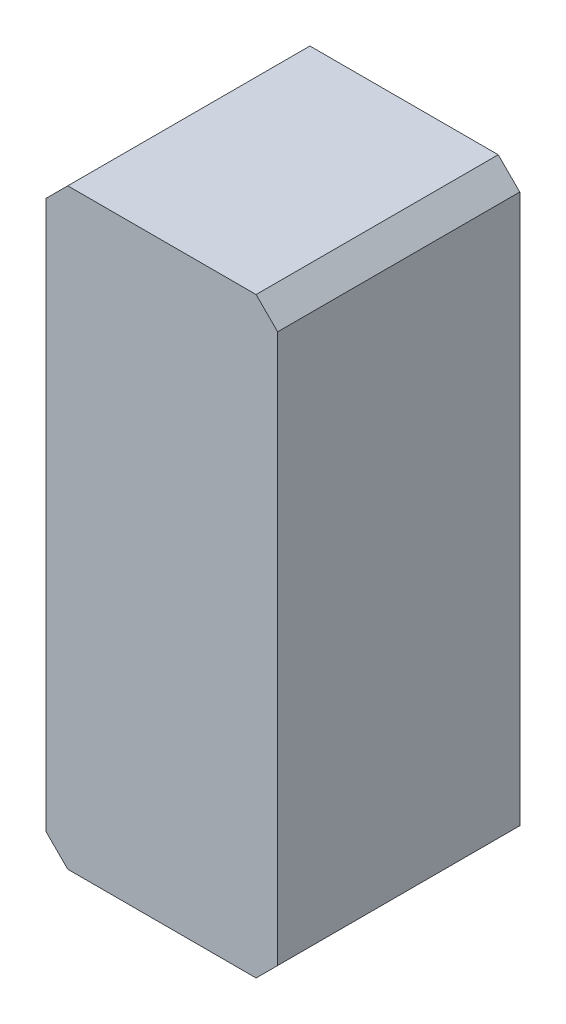
ISO-10303-21;
HEADER;
FILE_DESCRIPTION(('STEP AP214'),'2;1');
FILE_NAME('part.step','',(''),(''),'','','');
FILE_SCHEMA(('AUTOMOTIVE_DESIGN { 1 0 10303 214 1 1 1 1 }'));
ENDSEC;
DATA;
#1=APPLICATION_CONTEXT('core data for automotive mechanical design processes');
#2=APPLICATION_PROTOCOL_DEFINITION('international standard','automotive_design',2000,#1);
#3=PRODUCT_CONTEXT('',#1,'mechanical');
#4=PRODUCT('Part','Part','',(#3));
#5=PRODUCT_RELATED_PRODUCT_CATEGORY('part','',(#4));
#6=PRODUCT_DEFINITION_FORMATION('','',#4);
#7=PRODUCT_DEFINITION_CONTEXT('part definition',#1,'design');
#8=PRODUCT_DEFINITION('design','',#6,#7);
#9=PRODUCT_DEFINITION_SHAPE('','',#8);
#10=(LENGTH_UNIT() NAMED_UNIT(*) SI_UNIT(.MILLI.,.METRE.));
#11=(NAMED_UNIT(*) PLANE_ANGLE_UNIT() SI_UNIT($,.RADIAN.));
#12=(NAMED_UNIT(*) SI_UNIT($,.STERADIAN.) SOLID_ANGLE_UNIT());
#13=UNCERTAINTY_MEASURE_WITH_UNIT(LENGTH_MEASURE(1.E-05),#10,'distance_accuracy_value','');
#14=(GEOMETRIC_REPRESENTATION_CONTEXT(3) GLOBAL_UNCERTAINTY_ASSIGNED_CONTEXT((#13)) GLOBAL_UNIT_ASSIGNED_CONTEXT((#10,
#11,#12)) REPRESENTATION_CONTEXT('',''));
#15=CARTESIAN_POINT('',(0.,0.,0.));
#16=DIRECTION('',(0.,0.,1.));
#17=DIRECTION('',(1.,0.,0.));
#18=AXIS2_PLACEMENT_3D('',#15,#16,#17);
#19=CARTESIAN_POINT('',(-21.5,-51.,45.));
#20=DIRECTION('',(0.707106781186548,0.707106781186547,0.));
#21=DIRECTION('',(-0.707106781186547,0.707106781186548,0.));
#22=AXIS2_PLACEMENT_3D('',#19,#20,#21);
#23=PLANE('',#22);
#24=DIRECTION('',(0.707106781186547,-0.707106781186548,0.));
#25=VECTOR('',#24,1.);
#26=CARTESIAN_POINT('',(-21.5,-51.,0.));
#27=LINE('',#26,#25);
#28=CARTESIAN_POINT('',(-21.5,-51.,0.));
#29=VERTEX_POINT('',#28);
#30=CARTESIAN_POINT('',(-17.5,-55.,0.));
#31=VERTEX_POINT('',#30);
#32=EDGE_CURVE('E137',#29,#31,#27,.T.);
#33=ORIENTED_EDGE('',*,*,#32,.T.);
#34=DIRECTION('',(0.,0.,-1.));
#35=VECTOR('',#34,1.);
#36=CARTESIAN_POINT('',(-17.5,-55.,45.));
#37=LINE('',#36,#35);
#38=CARTESIAN_POINT('',(-17.5,-55.,45.));
#39=VERTEX_POINT('',#38);
#40=EDGE_CURVE('E11',#39,#31,#37,.T.);
#41=ORIENTED_EDGE('',*,*,#40,.F.);
#42=DIRECTION('',(0.707106781186547,-0.707106781186548,0.));
#43=VECTOR('',#42,1.);
#44=CARTESIAN_POINT('',(-21.5,-51.,45.));
#45=LINE('',#44,#43);
#46=CARTESIAN_POINT('',(-21.5,-51.,45.));
#47=VERTEX_POINT('',#46);
#48=EDGE_CURVE('E151',#47,#39,#45,.T.);
#49=ORIENTED_EDGE('',*,*,#48,.F.);
#50=DIRECTION('',(0.,0.,-1.));
#51=VECTOR('',#50,1.);
#52=CARTESIAN_POINT('',(-21.5,-51.,45.));
#53=LINE('',#52,#51);
#54=EDGE_CURVE('E133',#47,#29,#53,.T.);
#55=ORIENTED_EDGE('',*,*,#54,.T.);
#56=EDGE_LOOP('',(#33,#41,#49,#55));
#57=FACE_BOUND('',#56,.T.);
#58=ADVANCED_FACE('F41',(#57),#23,.F.);
#59=CARTESIAN_POINT('',(-17.5,-55.,45.));
#60=DIRECTION('',(0.,1.,0.));
#61=DIRECTION('',(0.,0.,1.));
#62=AXIS2_PLACEMENT_3D('',#59,#60,#61);
#63=PLANE('',#62);
#64=DIRECTION('',(1.,0.,0.));
#65=VECTOR('',#64,1.);
#66=CARTESIAN_POINT('',(-17.5,-55.,0.));
#67=LINE('',#66,#65);
#68=CARTESIAN_POINT('',(17.5,-55.,0.));
#69=VERTEX_POINT('',#68);
#70=EDGE_CURVE('E140',#31,#69,#67,.T.);
#71=ORIENTED_EDGE('',*,*,#70,.T.);
#72=DIRECTION('',(0.,0.,-1.));
#73=VECTOR('',#72,1.);
#74=CARTESIAN_POINT('',(17.5,-55.,45.));
#75=LINE('',#74,#73);
#76=CARTESIAN_POINT('',(17.5,-55.,45.));
#77=VERTEX_POINT('',#76);
#78=EDGE_CURVE('E49',#77,#69,#75,.T.);
#79=ORIENTED_EDGE('',*,*,#78,.F.);
#80=DIRECTION('',(1.,0.,0.));
#81=VECTOR('',#80,1.);
#82=CARTESIAN_POINT('',(-17.5,-55.,45.));
#83=LINE('',#82,#81);
#84=EDGE_CURVE('E100',#39,#77,#83,.T.);
#85=ORIENTED_EDGE('',*,*,#84,.F.);
#86=ORIENTED_EDGE('',*,*,#40,.T.);
#87=EDGE_LOOP('',(#71,#79,#85,#86));
#88=FACE_BOUND('',#87,.T.);
#89=ADVANCED_FACE('F186',(#88),#63,.F.);
#90=CARTESIAN_POINT('',(17.5,-55.,45.));
#91=DIRECTION('',(-0.707106781186548,0.707106781186547,0.));
#92=DIRECTION('',(-0.707106781186547,-0.707106781186548,0.));
#93=AXIS2_PLACEMENT_3D('',#90,#91,#92);
#94=PLANE('',#93);
#95=DIRECTION('',(0.707106781186547,0.707106781186548,0.));
#96=VECTOR('',#95,1.);
#97=CARTESIAN_POINT('',(17.5,-55.,0.));
#98=LINE('',#97,#96);
#99=CARTESIAN_POINT('',(21.5,-51.,0.));
#100=VERTEX_POINT('',#99);
#101=EDGE_CURVE('E142',#69,#100,#98,.T.);
#102=ORIENTED_EDGE('',*,*,#101,.T.);
#103=DIRECTION('',(0.,0.,-1.));
#104=VECTOR('',#103,1.);
#105=CARTESIAN_POINT('',(21.5,-51.,45.));
#106=LINE('',#105,#104);
#107=CARTESIAN_POINT('',(21.5,-51.,45.));
#108=VERTEX_POINT('',#107);
#109=EDGE_CURVE('E158',#108,#100,#106,.T.);
#110=ORIENTED_EDGE('',*,*,#109,.F.);
#111=DIRECTION('',(0.707106781186547,0.707106781186548,0.));
#112=VECTOR('',#111,1.);
#113=CARTESIAN_POINT('',(17.5,-55.,45.));
#114=LINE('',#113,#112);
#115=EDGE_CURVE('E166',#77,#108,#114,.T.);
#116=ORIENTED_EDGE('',*,*,#115,.F.);
#117=ORIENTED_EDGE('',*,*,#78,.T.);
#118=EDGE_LOOP('',(#102,#110,#116,#117));
#119=FACE_BOUND('',#118,.T.);
#120=ADVANCED_FACE('F164',(#119),#94,.F.);
#121=CARTESIAN_POINT('',(21.5,-51.,45.));
#122=DIRECTION('',(-1.,0.,0.));
#123=DIRECTION('',(0.,0.,1.));
#124=AXIS2_PLACEMENT_3D('',#121,#122,#123);
#125=PLANE('',#124);
#126=DIRECTION('',(0.,1.,0.));
#127=VECTOR('',#126,1.);
#128=CARTESIAN_POINT('',(21.5,-51.,0.));
#129=LINE('',#128,#127);
#130=CARTESIAN_POINT('',(21.5,51.,0.));
#131=VERTEX_POINT('',#130);
#132=EDGE_CURVE('E144',#100,#131,#129,.T.);
#133=ORIENTED_EDGE('',*,*,#132,.T.);
#134=DIRECTION('',(0.,0.,-1.));
#135=VECTOR('',#134,1.);
#136=CARTESIAN_POINT('',(21.5,51.,45.));
#137=LINE('',#136,#135);
#138=CARTESIAN_POINT('',(21.5,51.,45.));
#139=VERTEX_POINT('',#138);
#140=EDGE_CURVE('E155',#139,#131,#137,.T.);
#141=ORIENTED_EDGE('',*,*,#140,.F.);
#142=DIRECTION('',(0.,1.,0.));
#143=VECTOR('',#142,1.);
#144=CARTESIAN_POINT('',(21.5,-51.,45.));
#145=LINE('',#144,#143);
#146=EDGE_CURVE('E178',#108,#139,#145,.T.);
#147=ORIENTED_EDGE('',*,*,#146,.F.);
#148=ORIENTED_EDGE('',*,*,#109,.T.);
#149=EDGE_LOOP('',(#133,#141,#147,#148));
#150=FACE_BOUND('',#149,.T.);
#151=ADVANCED_FACE('F174',(#150),#125,.F.);
#152=CARTESIAN_POINT('',(21.5,51.,45.));
#153=DIRECTION('',(-0.707106781186548,-0.707106781186547,0.));
#154=DIRECTION('',(0.707106781186547,-0.707106781186548,0.));
#155=AXIS2_PLACEMENT_3D('',#152,#153,#154);
#156=PLANE('',#155);
#157=DIRECTION('',(-0.707106781186547,0.707106781186548,0.));
#158=VECTOR('',#157,1.);
#159=CARTESIAN_POINT('',(21.5,51.,0.));
#160=LINE('',#159,#158);
#161=CARTESIAN_POINT('',(17.5,55.,0.));
#162=VERTEX_POINT('',#161);
#163=EDGE_CURVE('E146',#131,#162,#160,.T.);
#164=ORIENTED_EDGE('',*,*,#163,.T.);
#165=DIRECTION('',(0.,0.,-1.));
#166=VECTOR('',#165,1.);
#167=CARTESIAN_POINT('',(17.5,55.,45.));
#168=LINE('',#167,#166);
#169=CARTESIAN_POINT('',(17.5,55.,45.));
#170=VERTEX_POINT('',#169);
#171=EDGE_CURVE('E128',#170,#162,#168,.T.);
#172=ORIENTED_EDGE('',*,*,#171,.F.);
#173=DIRECTION('',(-0.707106781186547,0.707106781186548,0.));
#174=VECTOR('',#173,1.);
#175=CARTESIAN_POINT('',(21.5,51.,45.));
#176=LINE('',#175,#174);
#177=EDGE_CURVE('E119',#139,#170,#176,.T.);
#178=ORIENTED_EDGE('',*,*,#177,.F.);
#179=ORIENTED_EDGE('',*,*,#140,.T.);
#180=EDGE_LOOP('',(#164,#172,#178,#179));
#181=FACE_BOUND('',#180,.T.);
#182=ADVANCED_FACE('F177',(#181),#156,.F.);
#183=CARTESIAN_POINT('',(17.5,55.,45.));
#184=DIRECTION('',(0.,-1.,0.));
#185=DIRECTION('',(0.,0.,-1.));
#186=AXIS2_PLACEMENT_3D('',#183,#184,#185);
#187=PLANE('',#186);
#188=DIRECTION('',(-1.,0.,0.));
#189=VECTOR('',#188,1.);
#190=CARTESIAN_POINT('',(17.5,55.,0.));
#191=LINE('',#190,#189);
#192=CARTESIAN_POINT('',(-17.5,55.,0.));
#193=VERTEX_POINT('',#192);
#194=EDGE_CURVE('E127',#162,#193,#191,.T.);
#195=ORIENTED_EDGE('',*,*,#194,.T.);
#196=DIRECTION('',(0.,0.,-1.));
#197=VECTOR('',#196,1.);
#198=CARTESIAN_POINT('',(-17.5,55.,45.));
#199=LINE('',#198,#197);
#200=CARTESIAN_POINT('',(-17.5,55.,45.));
#201=VERTEX_POINT('',#200);
#202=EDGE_CURVE('E124',#201,#193,#199,.T.);
#203=ORIENTED_EDGE('',*,*,#202,.F.);
#204=DIRECTION('',(-1.,0.,0.));
#205=VECTOR('',#204,1.);
#206=CARTESIAN_POINT('',(17.5,55.,45.));
#207=LINE('',#206,#205);
#208=EDGE_CURVE('E113',#170,#201,#207,.T.);
#209=ORIENTED_EDGE('',*,*,#208,.F.);
#210=ORIENTED_EDGE('',*,*,#171,.T.);
#211=EDGE_LOOP('',(#195,#203,#209,#210));
#212=FACE_BOUND('',#211,.T.);
#213=ADVANCED_FACE('F125',(#212),#187,.F.);
#214=CARTESIAN_POINT('',(-17.5,55.,45.));
#215=DIRECTION('',(0.707106781186548,-0.707106781186547,0.));
#216=DIRECTION('',(0.707106781186547,0.707106781186548,0.));
#217=AXIS2_PLACEMENT_3D('',#214,#215,#216);
#218=PLANE('',#217);
#219=DIRECTION('',(-0.707106781186547,-0.707106781186548,0.));
#220=VECTOR('',#219,1.);
#221=CARTESIAN_POINT('',(-17.5,55.,0.));
#222=LINE('',#221,#220);
#223=CARTESIAN_POINT('',(-21.5,51.,0.));
#224=VERTEX_POINT('',#223);
#225=EDGE_CURVE('E86',#193,#224,#222,.T.);
#226=ORIENTED_EDGE('',*,*,#225,.T.);
#227=DIRECTION('',(0.,0.,-1.));
#228=VECTOR('',#227,1.);
#229=CARTESIAN_POINT('',(-21.5,51.,45.));
#230=LINE('',#229,#228);
#231=CARTESIAN_POINT('',(-21.5,51.,45.));
#232=VERTEX_POINT('',#231);
#233=EDGE_CURVE('E129',#232,#224,#230,.T.);
#234=ORIENTED_EDGE('',*,*,#233,.F.);
#235=DIRECTION('',(-0.707106781186547,-0.707106781186548,0.));
#236=VECTOR('',#235,1.);
#237=CARTESIAN_POINT('',(-17.5,55.,45.));
#238=LINE('',#237,#236);
#239=EDGE_CURVE('E117',#201,#232,#238,.T.);
#240=ORIENTED_EDGE('',*,*,#239,.F.);
#241=ORIENTED_EDGE('',*,*,#202,.T.);
#242=EDGE_LOOP('',(#226,#234,#240,#241));
#243=FACE_BOUND('',#242,.T.);
#244=ADVANCED_FACE('F131',(#243),#218,.F.);
#245=CARTESIAN_POINT('',(-21.5,51.,45.));
#246=DIRECTION('',(1.,0.,0.));
#247=DIRECTION('',(0.,0.,-1.));
#248=AXIS2_PLACEMENT_3D('',#245,#246,#247);
#249=PLANE('',#248);
#250=DIRECTION('',(0.,-1.,0.));
#251=VECTOR('',#250,1.);
#252=CARTESIAN_POINT('',(-21.5,51.,0.));
#253=LINE('',#252,#251);
#254=EDGE_CURVE('E92',#224,#29,#253,.T.);
#255=ORIENTED_EDGE('',*,*,#254,.T.);
#256=ORIENTED_EDGE('',*,*,#54,.F.);
#257=DIRECTION('',(0.,-1.,0.));
#258=VECTOR('',#257,1.);
#259=CARTESIAN_POINT('',(-21.5,51.,45.));
#260=LINE('',#259,#258);
#261=EDGE_CURVE('E57',#232,#47,#260,.T.);
#262=ORIENTED_EDGE('',*,*,#261,.F.);
#263=ORIENTED_EDGE('',*,*,#233,.T.);
#264=EDGE_LOOP('',(#255,#256,#262,#263));
#265=FACE_BOUND('',#264,.T.);
#266=ADVANCED_FACE('F202',(#265),#249,.F.);
#267=CARTESIAN_POINT('',(0.,0.,45.));
#268=DIRECTION('',(0.,0.,1.));
#269=DIRECTION('',(1.,0.,0.));
#270=AXIS2_PLACEMENT_3D('',#267,#268,#269);
#271=PLANE('',#270);
#272=ORIENTED_EDGE('',*,*,#48,.T.);
#273=ORIENTED_EDGE('',*,*,#84,.T.);
#274=ORIENTED_EDGE('',*,*,#115,.T.);
#275=ORIENTED_EDGE('',*,*,#146,.T.);
#276=ORIENTED_EDGE('',*,*,#177,.T.);
#277=ORIENTED_EDGE('',*,*,#208,.T.);
#278=ORIENTED_EDGE('',*,*,#239,.T.);
#279=ORIENTED_EDGE('',*,*,#261,.T.);
#280=EDGE_LOOP('',(#272,#273,#274,#275,#276,#277,#278,#279));
#281=FACE_BOUND('',#280,.T.);
#282=ADVANCED_FACE('F115',(#281),#271,.T.);
#283=CARTESIAN_POINT('',(0.,0.,0.));
#284=DIRECTION('',(0.,0.,1.));
#285=DIRECTION('',(1.,0.,0.));
#286=AXIS2_PLACEMENT_3D('',#283,#284,#285);
#287=PLANE('',#286);
#288=ORIENTED_EDGE('',*,*,#32,.F.);
#289=ORIENTED_EDGE('',*,*,#254,.F.);
#290=ORIENTED_EDGE('',*,*,#225,.F.);
#291=ORIENTED_EDGE('',*,*,#194,.F.);
#292=ORIENTED_EDGE('',*,*,#163,.F.);
#293=ORIENTED_EDGE('',*,*,#132,.F.);
#294=ORIENTED_EDGE('',*,*,#101,.F.);
#295=ORIENTED_EDGE('',*,*,#70,.F.);
#296=EDGE_LOOP('',(#288,#289,#290,#291,#292,#293,#294,#295));
#297=FACE_BOUND('',#296,.T.);
#298=ADVANCED_FACE('F170',(#297),#287,.F.);
#299=CLOSED_SHELL('',(#58,#89,#120,#151,#182,#213,#244,#266,#282,#298));
#300=MANIFOLD_SOLID_BREP('B2',#299);
#301=ADVANCED_BREP_SHAPE_REPRESENTATION('',(#18,#300),#14);
#302=SHAPE_DEFINITION_REPRESENTATION(#9,#301);
ENDSEC;
END-ISO-10303-21;
